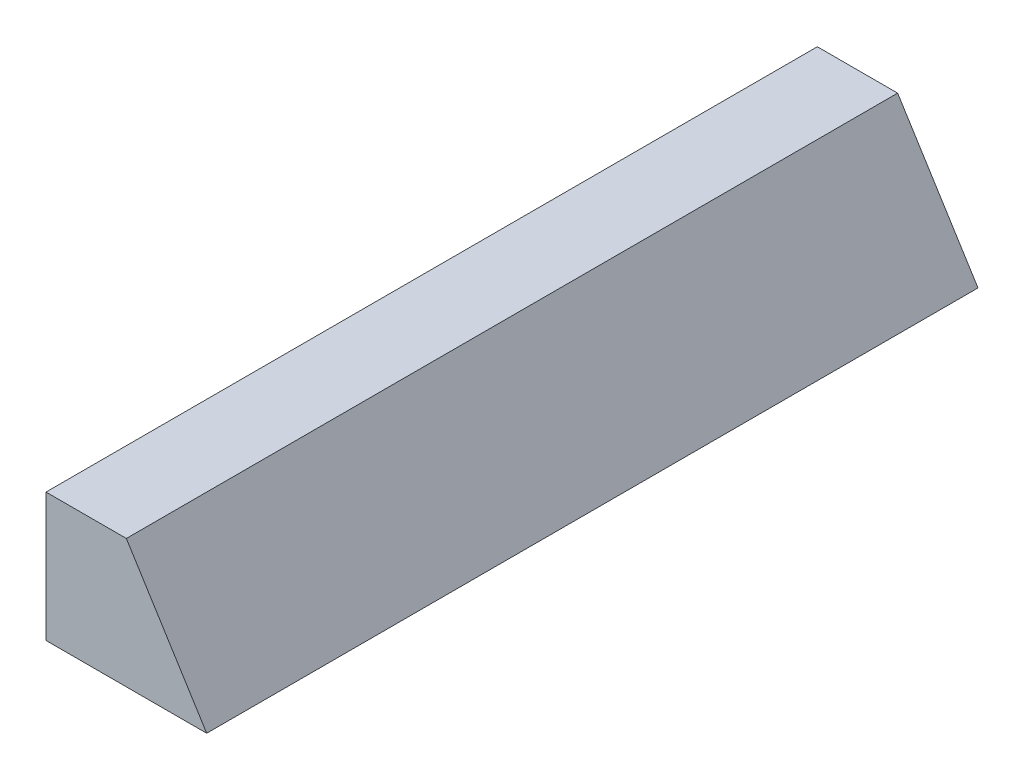
ISO-10303-21;
HEADER;
FILE_DESCRIPTION(('STEP AP214'),'2;1');
FILE_NAME('part.step','',(''),(''),'','','');
FILE_SCHEMA(('AUTOMOTIVE_DESIGN { 1 0 10303 214 1 1 1 1 }'));
ENDSEC;
DATA;
#1=APPLICATION_CONTEXT('core data for automotive mechanical design processes');
#2=APPLICATION_PROTOCOL_DEFINITION('international standard','automotive_design',2000,#1);
#3=PRODUCT_CONTEXT('',#1,'mechanical');
#4=PRODUCT('Part','Part','',(#3));
#5=PRODUCT_RELATED_PRODUCT_CATEGORY('part','',(#4));
#6=PRODUCT_DEFINITION_FORMATION('','',#4);
#7=PRODUCT_DEFINITION_CONTEXT('part definition',#1,'design');
#8=PRODUCT_DEFINITION('design','',#6,#7);
#9=PRODUCT_DEFINITION_SHAPE('','',#8);
#10=(LENGTH_UNIT() NAMED_UNIT(*) SI_UNIT(.MILLI.,.METRE.));
#11=(NAMED_UNIT(*) PLANE_ANGLE_UNIT() SI_UNIT($,.RADIAN.));
#12=(NAMED_UNIT(*) SI_UNIT($,.STERADIAN.) SOLID_ANGLE_UNIT());
#13=UNCERTAINTY_MEASURE_WITH_UNIT(LENGTH_MEASURE(1.E-05),#10,'distance_accuracy_value','');
#14=(GEOMETRIC_REPRESENTATION_CONTEXT(3) GLOBAL_UNCERTAINTY_ASSIGNED_CONTEXT((#13)) GLOBAL_UNIT_ASSIGNED_CONTEXT((#10,
#11,#12)) REPRESENTATION_CONTEXT('',''));
#15=CARTESIAN_POINT('',(0.,0.,0.));
#16=DIRECTION('',(0.,0.,1.));
#17=DIRECTION('',(1.,0.,0.));
#18=AXIS2_PLACEMENT_3D('',#15,#16,#17);
#19=CARTESIAN_POINT('',(-52.0654804270463,0.,609.6));
#20=DIRECTION('',(-1.,0.,0.));
#21=DIRECTION('',(0.,0.,1.));
#22=AXIS2_PLACEMENT_3D('',#19,#20,#21);
#23=PLANE('',#22);
#24=DIRECTION('',(0.,1.,0.));
#25=VECTOR('',#24,1.);
#26=CARTESIAN_POINT('',(-52.0654804270463,0.,0.));
#27=LINE('',#26,#25);
#28=CARTESIAN_POINT('',(-52.0654804270463,-13.4869699448382,0.));
#29=VERTEX_POINT('',#28);
#30=CARTESIAN_POINT('',(-52.0654804270463,88.1130300551618,0.));
#31=VERTEX_POINT('',#30);
#32=EDGE_CURVE('E153',#29,#31,#27,.T.);
#33=ORIENTED_EDGE('',*,*,#32,.F.);
#34=DIRECTION('',(0.,0.,-1.));
#35=VECTOR('',#34,1.);
#36=CARTESIAN_POINT('',(-52.0654804270463,-13.4869699448382,609.6));
#37=LINE('',#36,#35);
#38=CARTESIAN_POINT('',(-52.0654804270463,-13.4869699448382,609.6));
#39=VERTEX_POINT('',#38);
#40=EDGE_CURVE('E61',#39,#29,#37,.T.);
#41=ORIENTED_EDGE('',*,*,#40,.F.);
#42=DIRECTION('',(0.,1.,0.));
#43=VECTOR('',#42,1.);
#44=CARTESIAN_POINT('',(-52.0654804270463,0.,609.6));
#45=LINE('',#44,#43);
#46=CARTESIAN_POINT('',(-52.0654804270463,88.1130300551618,609.6));
#47=VERTEX_POINT('',#46);
#48=EDGE_CURVE('E158',#39,#47,#45,.T.);
#49=ORIENTED_EDGE('',*,*,#48,.T.);
#50=DIRECTION('',(0.,0.,-1.));
#51=VECTOR('',#50,1.);
#52=CARTESIAN_POINT('',(-52.0654804270463,88.1130300551618,609.6));
#53=LINE('',#52,#51);
#54=EDGE_CURVE('E170',#47,#31,#53,.T.);
#55=ORIENTED_EDGE('',*,*,#54,.T.);
#56=EDGE_LOOP('',(#33,#41,#49,#55));
#57=FACE_BOUND('',#56,.T.);
#58=DIRECTION('',(0.,0.,-1.));
#59=VECTOR('',#58,1.);
#60=CARTESIAN_POINT('',(-52.0654804270463,-10.9469699448382,609.6));
#61=LINE('',#60,#59);
#62=CARTESIAN_POINT('',(-52.0654804270463,-10.9469699448382,607.06));
#63=VERTEX_POINT('',#62);
#64=CARTESIAN_POINT('',(-52.0654804270463,-10.9469699448382,2.54));
#65=VERTEX_POINT('',#64);
#66=EDGE_CURVE('E146',#63,#65,#61,.T.);
#67=ORIENTED_EDGE('',*,*,#66,.T.);
#68=DIRECTION('',(0.,1.,0.));
#69=VECTOR('',#68,1.);
#70=CARTESIAN_POINT('',(-52.0654804270463,0.,2.53999999999999));
#71=LINE('',#70,#69);
#72=CARTESIAN_POINT('',(-52.0654804270463,85.5730300551618,2.54));
#73=VERTEX_POINT('',#72);
#74=EDGE_CURVE('E134',#65,#73,#71,.T.);
#75=ORIENTED_EDGE('',*,*,#74,.T.);
#76=DIRECTION('',(0.,0.,-1.));
#77=VECTOR('',#76,1.);
#78=CARTESIAN_POINT('',(-52.0654804270463,85.5730300551618,609.6));
#79=LINE('',#78,#77);
#80=CARTESIAN_POINT('',(-52.0654804270463,85.5730300551618,607.06));
#81=VERTEX_POINT('',#80);
#82=EDGE_CURVE('E141',#81,#73,#79,.T.);
#83=ORIENTED_EDGE('',*,*,#82,.F.);
#84=DIRECTION('',(0.,1.,0.));
#85=VECTOR('',#84,1.);
#86=CARTESIAN_POINT('',(-52.0654804270463,0.,607.06));
#87=LINE('',#86,#85);
#88=EDGE_CURVE('E52',#63,#81,#87,.T.);
#89=ORIENTED_EDGE('',*,*,#88,.F.);
#90=EDGE_LOOP('',(#67,#75,#83,#89));
#91=FACE_BOUND('',#90,.T.);
#92=ADVANCED_FACE('F37',(#57,#91),#23,.T.);
#93=CARTESIAN_POINT('',(0.,-13.4869699448382,609.6));
#94=DIRECTION('',(0.,1.,0.));
#95=DIRECTION('',(-1.,0.,0.));
#96=AXIS2_PLACEMENT_3D('',#93,#94,#95);
#97=PLANE('',#96);
#98=DIRECTION('',(1.,0.,0.));
#99=VECTOR('',#98,1.);
#100=CARTESIAN_POINT('',(0.,-13.4869699448382,0.));
#101=LINE('',#100,#99);
#102=CARTESIAN_POINT('',(74.9345195729537,-13.4869699448382,0.));
#103=VERTEX_POINT('',#102);
#104=EDGE_CURVE('E130',#29,#103,#101,.T.);
#105=ORIENTED_EDGE('',*,*,#104,.T.);
#106=DIRECTION('',(0.,0.,-1.));
#107=VECTOR('',#106,1.);
#108=CARTESIAN_POINT('',(74.9345195729537,-13.4869699448382,609.6));
#109=LINE('',#108,#107);
#110=CARTESIAN_POINT('',(74.9345195729537,-13.4869699448382,609.6));
#111=VERTEX_POINT('',#110);
#112=EDGE_CURVE('E11',#111,#103,#109,.T.);
#113=ORIENTED_EDGE('',*,*,#112,.F.);
#114=DIRECTION('',(1.,0.,0.));
#115=VECTOR('',#114,1.);
#116=CARTESIAN_POINT('',(0.,-13.4869699448382,609.6));
#117=LINE('',#116,#115);
#118=EDGE_CURVE('E151',#39,#111,#117,.T.);
#119=ORIENTED_EDGE('',*,*,#118,.F.);
#120=ORIENTED_EDGE('',*,*,#40,.T.);
#121=EDGE_LOOP('',(#105,#113,#119,#120));
#122=FACE_BOUND('',#121,.T.);
#123=ADVANCED_FACE('F39',(#122),#97,.F.);
#124=CARTESIAN_POINT('',(47.8239376952305,29.889961059519,609.6));
#125=DIRECTION('',(-0.847998304005088,-0.52999894000318,0.));
#126=DIRECTION('',(0.52999894000318,-0.847998304005088,0.));
#127=AXIS2_PLACEMENT_3D('',#124,#125,#126);
#128=PLANE('',#127);
#129=DIRECTION('',(-0.52999894000318,0.847998304005088,0.));
#130=VECTOR('',#129,1.);
#131=CARTESIAN_POINT('',(47.8239376952305,29.889961059519,0.));
#132=LINE('',#131,#130);
#133=CARTESIAN_POINT('',(11.4345195729537,88.1130300551618,0.));
#134=VERTEX_POINT('',#133);
#135=EDGE_CURVE('E161',#103,#134,#132,.T.);
#136=ORIENTED_EDGE('',*,*,#135,.T.);
#137=DIRECTION('',(0.,0.,-1.));
#138=VECTOR('',#137,1.);
#139=CARTESIAN_POINT('',(11.4345195729537,88.1130300551618,609.6));
#140=LINE('',#139,#138);
#141=CARTESIAN_POINT('',(11.4345195729537,88.1130300551618,609.6));
#142=VERTEX_POINT('',#141);
#143=EDGE_CURVE('E45',#142,#134,#140,.T.);
#144=ORIENTED_EDGE('',*,*,#143,.F.);
#145=DIRECTION('',(-0.52999894000318,0.847998304005088,0.));
#146=VECTOR('',#145,1.);
#147=CARTESIAN_POINT('',(47.8239376952305,29.889961059519,609.6));
#148=LINE('',#147,#146);
#149=EDGE_CURVE('E87',#111,#142,#148,.T.);
#150=ORIENTED_EDGE('',*,*,#149,.F.);
#151=ORIENTED_EDGE('',*,*,#112,.T.);
#152=EDGE_LOOP('',(#136,#144,#150,#151));
#153=FACE_BOUND('',#152,.T.);
#154=ADVANCED_FACE('F175',(#153),#128,.F.);
#155=CARTESIAN_POINT('',(0.,88.1130300551618,609.6));
#156=DIRECTION('',(0.,1.,0.));
#157=DIRECTION('',(0.,0.,1.));
#158=AXIS2_PLACEMENT_3D('',#155,#156,#157);
#159=PLANE('',#158);
#160=DIRECTION('',(1.,0.,0.));
#161=VECTOR('',#160,1.);
#162=CARTESIAN_POINT('',(0.,88.1130300551618,0.));
#163=LINE('',#162,#161);
#164=EDGE_CURVE('E164',#31,#134,#163,.T.);
#165=ORIENTED_EDGE('',*,*,#164,.F.);
#166=ORIENTED_EDGE('',*,*,#54,.F.);
#167=DIRECTION('',(1.,0.,0.));
#168=VECTOR('',#167,1.);
#169=CARTESIAN_POINT('',(0.,88.1130300551618,609.6));
#170=LINE('',#169,#168);
#171=EDGE_CURVE('E155',#47,#142,#170,.T.);
#172=ORIENTED_EDGE('',*,*,#171,.T.);
#173=ORIENTED_EDGE('',*,*,#143,.T.);
#174=EDGE_LOOP('',(#165,#166,#172,#173));
#175=FACE_BOUND('',#174,.T.);
#176=ADVANCED_FACE('F173',(#175),#159,.T.);
#177=CARTESIAN_POINT('',(0.,0.,609.6));
#178=DIRECTION('',(0.,0.,1.));
#179=DIRECTION('',(1.,0.,0.));
#180=AXIS2_PLACEMENT_3D('',#177,#178,#179);
#181=PLANE('',#180);
#182=ORIENTED_EDGE('',*,*,#118,.T.);
#183=ORIENTED_EDGE('',*,*,#149,.T.);
#184=ORIENTED_EDGE('',*,*,#171,.F.);
#185=ORIENTED_EDGE('',*,*,#48,.F.);
#186=EDGE_LOOP('',(#182,#183,#184,#185));
#187=FACE_BOUND('',#186,.T.);
#188=ADVANCED_FACE('F182',(#187),#181,.T.);
#189=CARTESIAN_POINT('',(0.,0.,0.));
#190=DIRECTION('',(0.,0.,1.));
#191=DIRECTION('',(1.,0.,0.));
#192=AXIS2_PLACEMENT_3D('',#189,#190,#191);
#193=PLANE('',#192);
#194=ORIENTED_EDGE('',*,*,#104,.F.);
#195=ORIENTED_EDGE('',*,*,#32,.T.);
#196=ORIENTED_EDGE('',*,*,#164,.T.);
#197=ORIENTED_EDGE('',*,*,#135,.F.);
#198=EDGE_LOOP('',(#194,#195,#196,#197));
#199=FACE_BOUND('',#198,.T.);
#200=ADVANCED_FACE('F178',(#199),#193,.F.);
#201=CARTESIAN_POINT('',(0.,-10.9469699448382,609.6));
#202=DIRECTION('',(0.,1.,0.));
#203=DIRECTION('',(-1.,0.,0.));
#204=AXIS2_PLACEMENT_3D('',#201,#202,#203);
#205=PLANE('',#204);
#206=DIRECTION('',(1.,0.,0.));
#207=VECTOR('',#206,1.);
#208=CARTESIAN_POINT('',(0.,-10.9469699448382,2.53999999999999));
#209=LINE('',#208,#207);
#210=CARTESIAN_POINT('',(70.3517305635258,-10.9469699448382,2.54));
#211=VERTEX_POINT('',#210);
#212=EDGE_CURVE('E123',#65,#211,#209,.T.);
#213=ORIENTED_EDGE('',*,*,#212,.F.);
#214=ORIENTED_EDGE('',*,*,#66,.F.);
#215=DIRECTION('',(1.,0.,0.));
#216=VECTOR('',#215,1.);
#217=CARTESIAN_POINT('',(0.,-10.9469699448382,607.06));
#218=LINE('',#217,#216);
#219=CARTESIAN_POINT('',(70.3517305635258,-10.9469699448382,607.06));
#220=VERTEX_POINT('',#219);
#221=EDGE_CURVE('E129',#63,#220,#218,.T.);
#222=ORIENTED_EDGE('',*,*,#221,.T.);
#223=DIRECTION('',(0.,0.,-1.));
#224=VECTOR('',#223,1.);
#225=CARTESIAN_POINT('',(70.3517305635258,-10.9469699448382,609.6));
#226=LINE('',#225,#224);
#227=EDGE_CURVE('E115',#220,#211,#226,.T.);
#228=ORIENTED_EDGE('',*,*,#227,.T.);
#229=EDGE_LOOP('',(#213,#214,#222,#228));
#230=FACE_BOUND('',#229,.T.);
#231=ADVANCED_FACE('F127',(#230),#205,.T.);
#232=CARTESIAN_POINT('',(45.6700220030575,28.543763751911,609.6));
#233=DIRECTION('',(-0.847998304005088,-0.52999894000318,0.));
#234=DIRECTION('',(0.52999894000318,-0.847998304005088,0.));
#235=AXIS2_PLACEMENT_3D('',#232,#233,#234);
#236=PLANE('',#235);
#237=DIRECTION('',(-0.52999894000318,0.847998304005088,0.));
#238=VECTOR('',#237,1.);
#239=CARTESIAN_POINT('',(45.6700220030575,28.543763751911,2.53999999999999));
#240=LINE('',#239,#238);
#241=CARTESIAN_POINT('',(10.0267305635258,85.5730300551618,2.54));
#242=VERTEX_POINT('',#241);
#243=EDGE_CURVE('E112',#211,#242,#240,.T.);
#244=ORIENTED_EDGE('',*,*,#243,.F.);
#245=ORIENTED_EDGE('',*,*,#227,.F.);
#246=DIRECTION('',(-0.52999894000318,0.847998304005088,0.));
#247=VECTOR('',#246,1.);
#248=CARTESIAN_POINT('',(45.6700220030575,28.543763751911,607.06));
#249=LINE('',#248,#247);
#250=CARTESIAN_POINT('',(10.0267305635258,85.5730300551618,607.06));
#251=VERTEX_POINT('',#250);
#252=EDGE_CURVE('E138',#220,#251,#249,.T.);
#253=ORIENTED_EDGE('',*,*,#252,.T.);
#254=DIRECTION('',(0.,0.,-1.));
#255=VECTOR('',#254,1.);
#256=CARTESIAN_POINT('',(10.0267305635258,85.5730300551618,609.6));
#257=LINE('',#256,#255);
#258=EDGE_CURVE('E117',#251,#242,#257,.T.);
#259=ORIENTED_EDGE('',*,*,#258,.T.);
#260=EDGE_LOOP('',(#244,#245,#253,#259));
#261=FACE_BOUND('',#260,.T.);
#262=ADVANCED_FACE('F114',(#261),#236,.T.);
#263=CARTESIAN_POINT('',(0.,85.5730300551618,609.6));
#264=DIRECTION('',(0.,1.,0.));
#265=DIRECTION('',(0.,0.,1.));
#266=AXIS2_PLACEMENT_3D('',#263,#264,#265);
#267=PLANE('',#266);
#268=DIRECTION('',(1.,0.,0.));
#269=VECTOR('',#268,1.);
#270=CARTESIAN_POINT('',(0.,85.5730300551618,2.53999999999999));
#271=LINE('',#270,#269);
#272=EDGE_CURVE('E122',#73,#242,#271,.T.);
#273=ORIENTED_EDGE('',*,*,#272,.T.);
#274=ORIENTED_EDGE('',*,*,#258,.F.);
#275=DIRECTION('',(1.,0.,0.));
#276=VECTOR('',#275,1.);
#277=CARTESIAN_POINT('',(0.,85.5730300551618,607.06));
#278=LINE('',#277,#276);
#279=EDGE_CURVE('E143',#81,#251,#278,.T.);
#280=ORIENTED_EDGE('',*,*,#279,.F.);
#281=ORIENTED_EDGE('',*,*,#82,.T.);
#282=EDGE_LOOP('',(#273,#274,#280,#281));
#283=FACE_BOUND('',#282,.T.);
#284=ADVANCED_FACE('F207',(#283),#267,.F.);
#285=CARTESIAN_POINT('',(0.,0.,607.06));
#286=DIRECTION('',(0.,0.,1.));
#287=DIRECTION('',(1.,0.,0.));
#288=AXIS2_PLACEMENT_3D('',#285,#286,#287);
#289=PLANE('',#288);
#290=ORIENTED_EDGE('',*,*,#221,.F.);
#291=ORIENTED_EDGE('',*,*,#88,.T.);
#292=ORIENTED_EDGE('',*,*,#279,.T.);
#293=ORIENTED_EDGE('',*,*,#252,.F.);
#294=EDGE_LOOP('',(#290,#291,#292,#293));
#295=FACE_BOUND('',#294,.T.);
#296=ADVANCED_FACE('F204',(#295),#289,.F.);
#297=CARTESIAN_POINT('',(0.,0.,2.54));
#298=DIRECTION('',(0.,0.,1.));
#299=DIRECTION('',(1.,0.,0.));
#300=AXIS2_PLACEMENT_3D('',#297,#298,#299);
#301=PLANE('',#300);
#302=ORIENTED_EDGE('',*,*,#212,.T.);
#303=ORIENTED_EDGE('',*,*,#243,.T.);
#304=ORIENTED_EDGE('',*,*,#272,.F.);
#305=ORIENTED_EDGE('',*,*,#74,.F.);
#306=EDGE_LOOP('',(#302,#303,#304,#305));
#307=FACE_BOUND('',#306,.T.);
#308=ADVANCED_FACE('F132',(#307),#301,.T.);
#309=CLOSED_SHELL('',(#92,#123,#154,#176,#188,#200,#231,#262,#284,#296,#308));
#310=MANIFOLD_SOLID_BREP('B2',#309);
#311=ADVANCED_BREP_SHAPE_REPRESENTATION('',(#18,#310),#14);
#312=SHAPE_DEFINITION_REPRESENTATION(#9,#311);
ENDSEC;
END-ISO-10303-21;
